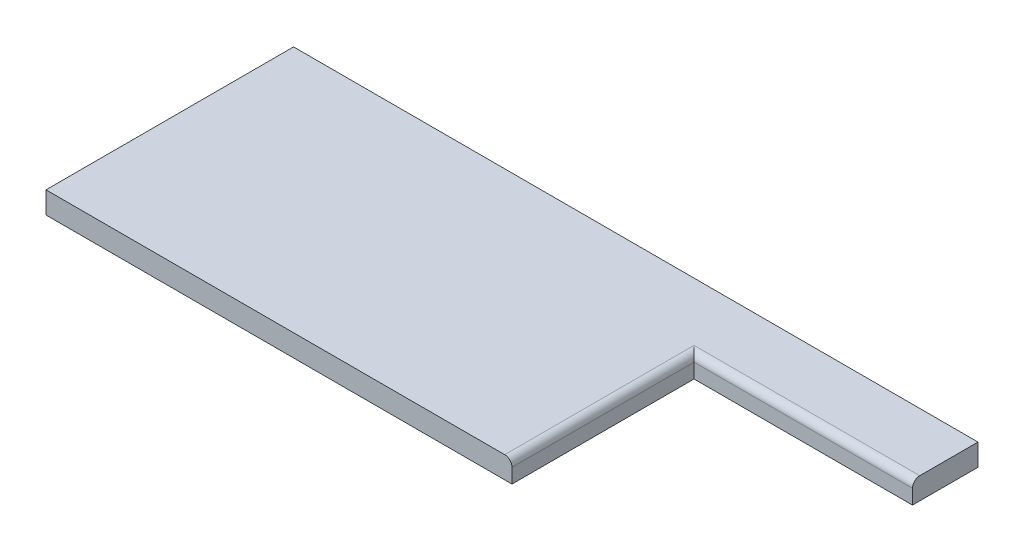
ISO-10303-21;
HEADER;
FILE_DESCRIPTION(('STEP AP214'),'2;1');
FILE_NAME('part.step','',(''),(''),'','','');
FILE_SCHEMA(('AUTOMOTIVE_DESIGN { 1 0 10303 214 1 1 1 1 }'));
ENDSEC;
DATA;
#1=APPLICATION_CONTEXT('core data for automotive mechanical design processes');
#2=APPLICATION_PROTOCOL_DEFINITION('international standard','automotive_design',2000,#1);
#3=PRODUCT_CONTEXT('',#1,'mechanical');
#4=PRODUCT('Part','Part','',(#3));
#5=PRODUCT_RELATED_PRODUCT_CATEGORY('part','',(#4));
#6=PRODUCT_DEFINITION_FORMATION('','',#4);
#7=PRODUCT_DEFINITION_CONTEXT('part definition',#1,'design');
#8=PRODUCT_DEFINITION('design','',#6,#7);
#9=PRODUCT_DEFINITION_SHAPE('','',#8);
#10=(LENGTH_UNIT() NAMED_UNIT(*) SI_UNIT(.MILLI.,.METRE.));
#11=(NAMED_UNIT(*) PLANE_ANGLE_UNIT() SI_UNIT($,.RADIAN.));
#12=(NAMED_UNIT(*) SI_UNIT($,.STERADIAN.) SOLID_ANGLE_UNIT());
#13=UNCERTAINTY_MEASURE_WITH_UNIT(LENGTH_MEASURE(1.E-05),#10,'distance_accuracy_value','');
#14=(GEOMETRIC_REPRESENTATION_CONTEXT(3) GLOBAL_UNCERTAINTY_ASSIGNED_CONTEXT((#13)) GLOBAL_UNIT_ASSIGNED_CONTEXT((#10,
#11,#12)) REPRESENTATION_CONTEXT('',''));
#15=CARTESIAN_POINT('',(0.,0.,0.));
#16=DIRECTION('',(0.,0.,1.));
#17=DIRECTION('',(1.,0.,0.));
#18=AXIS2_PLACEMENT_3D('',#15,#16,#17);
#19=CARTESIAN_POINT('',(0.,6.,0.));
#20=DIRECTION('',(1.,0.,0.));
#21=DIRECTION('',(0.,0.,-1.));
#22=AXIS2_PLACEMENT_3D('',#19,#20,#21);
#23=PLANE('',#22);
#24=DIRECTION('',(0.,0.,1.));
#25=VECTOR('',#24,1.);
#26=CARTESIAN_POINT('',(0.,0.,0.));
#27=LINE('',#26,#25);
#28=CARTESIAN_POINT('',(0.,0.,-68.));
#29=VERTEX_POINT('',#28);
#30=CARTESIAN_POINT('',(0.,0.,0.));
#31=VERTEX_POINT('',#30);
#32=EDGE_CURVE('E121',#29,#31,#27,.T.);
#33=ORIENTED_EDGE('',*,*,#32,.T.);
#34=DIRECTION('',(0.,-1.,0.));
#35=VECTOR('',#34,1.);
#36=CARTESIAN_POINT('',(0.,6.,0.));
#37=LINE('',#36,#35);
#38=CARTESIAN_POINT('',(0.,6.,0.));
#39=VERTEX_POINT('',#38);
#40=EDGE_CURVE('E131',#39,#31,#37,.T.);
#41=ORIENTED_EDGE('',*,*,#40,.F.);
#42=DIRECTION('',(0.,0.,1.));
#43=VECTOR('',#42,1.);
#44=CARTESIAN_POINT('',(0.,6.,0.));
#45=LINE('',#44,#43);
#46=CARTESIAN_POINT('',(0.,6.,-68.));
#47=VERTEX_POINT('',#46);
#48=EDGE_CURVE('E118',#47,#39,#45,.T.);
#49=ORIENTED_EDGE('',*,*,#48,.F.);
#50=DIRECTION('',(0.,-1.,0.));
#51=VECTOR('',#50,1.);
#52=CARTESIAN_POINT('',(0.,6.,-68.));
#53=LINE('',#52,#51);
#54=EDGE_CURVE('E125',#47,#29,#53,.T.);
#55=ORIENTED_EDGE('',*,*,#54,.T.);
#56=EDGE_LOOP('',(#33,#41,#49,#55));
#57=FACE_BOUND('',#56,.T.);
#58=ADVANCED_FACE('F32',(#57),#23,.F.);
#59=CARTESIAN_POINT('',(0.,6.,0.));
#60=DIRECTION('',(0.,0.,-1.));
#61=DIRECTION('',(-1.,0.,0.));
#62=AXIS2_PLACEMENT_3D('',#59,#60,#61);
#63=PLANE('',#62);
#64=DIRECTION('',(0.,1.,0.));
#65=VECTOR('',#64,1.);
#66=CARTESIAN_POINT('',(128.,0.,0.));
#67=LINE('',#66,#65);
#68=CARTESIAN_POINT('',(128.,0.,0.));
#69=VERTEX_POINT('',#68);
#70=CARTESIAN_POINT('',(128.,4.,0.));
#71=VERTEX_POINT('',#70);
#72=EDGE_CURVE('E148',#69,#71,#67,.T.);
#73=ORIENTED_EDGE('',*,*,#72,.T.);
#74=CARTESIAN_POINT('',(126.,4.,0.));
#75=DIRECTION('',(0.,0.,-1.));
#76=DIRECTION('',(-1.,0.,0.));
#77=AXIS2_PLACEMENT_3D('',#74,#75,#76);
#78=CIRCLE('',#77,2.);
#79=CARTESIAN_POINT('',(126.,6.,0.));
#80=VERTEX_POINT('',#79);
#81=EDGE_CURVE('E137',#71,#80,#78,.F.);
#82=ORIENTED_EDGE('',*,*,#81,.T.);
#83=DIRECTION('',(1.,0.,0.));
#84=VECTOR('',#83,1.);
#85=CARTESIAN_POINT('',(0.,6.,0.));
#86=LINE('',#85,#84);
#87=EDGE_CURVE('E155',#39,#80,#86,.T.);
#88=ORIENTED_EDGE('',*,*,#87,.F.);
#89=ORIENTED_EDGE('',*,*,#40,.T.);
#90=DIRECTION('',(1.,0.,0.));
#91=VECTOR('',#90,1.);
#92=CARTESIAN_POINT('',(0.,0.,0.));
#93=LINE('',#92,#91);
#94=EDGE_CURVE('E116',#31,#69,#93,.T.);
#95=ORIENTED_EDGE('',*,*,#94,.T.);
#96=EDGE_LOOP('',(#73,#82,#88,#89,#95));
#97=FACE_BOUND('',#96,.T.);
#98=ADVANCED_FACE('F154',(#97),#63,.F.);
#99=CARTESIAN_POINT('',(188.,6.,0.));
#100=DIRECTION('',(-1.,0.,0.));
#101=DIRECTION('',(0.,0.,1.));
#102=AXIS2_PLACEMENT_3D('',#99,#100,#101);
#103=PLANE('',#102);
#104=DIRECTION('',(0.,0.,-1.));
#105=VECTOR('',#104,1.);
#106=CARTESIAN_POINT('',(188.,6.,0.));
#107=LINE('',#106,#105);
#108=CARTESIAN_POINT('',(188.,6.,-52.));
#109=VERTEX_POINT('',#108);
#110=CARTESIAN_POINT('',(188.,6.,-68.));
#111=VERTEX_POINT('',#110);
#112=EDGE_CURVE('E160',#109,#111,#107,.T.);
#113=ORIENTED_EDGE('',*,*,#112,.F.);
#114=CARTESIAN_POINT('',(188.,4.,-52.));
#115=DIRECTION('',(-1.,0.,0.));
#116=DIRECTION('',(0.,0.,1.));
#117=AXIS2_PLACEMENT_3D('',#114,#115,#116);
#118=CIRCLE('',#117,2.);
#119=CARTESIAN_POINT('',(188.,4.,-50.));
#120=VERTEX_POINT('',#119);
#121=EDGE_CURVE('E11',#109,#120,#118,.F.);
#122=ORIENTED_EDGE('',*,*,#121,.T.);
#123=DIRECTION('',(0.,1.,0.));
#124=VECTOR('',#123,1.);
#125=CARTESIAN_POINT('',(188.,0.,-50.));
#126=LINE('',#125,#124);
#127=CARTESIAN_POINT('',(188.,0.,-50.));
#128=VERTEX_POINT('',#127);
#129=EDGE_CURVE('E98',#128,#120,#126,.T.);
#130=ORIENTED_EDGE('',*,*,#129,.F.);
#131=DIRECTION('',(0.,0.,-1.));
#132=VECTOR('',#131,1.);
#133=CARTESIAN_POINT('',(188.,0.,0.));
#134=LINE('',#133,#132);
#135=CARTESIAN_POINT('',(188.,0.,-68.));
#136=VERTEX_POINT('',#135);
#137=EDGE_CURVE('E109',#128,#136,#134,.T.);
#138=ORIENTED_EDGE('',*,*,#137,.T.);
#139=DIRECTION('',(0.,-1.,0.));
#140=VECTOR('',#139,1.);
#141=CARTESIAN_POINT('',(188.,6.,-68.));
#142=LINE('',#141,#140);
#143=EDGE_CURVE('E128',#111,#136,#142,.T.);
#144=ORIENTED_EDGE('',*,*,#143,.F.);
#145=EDGE_LOOP('',(#113,#122,#130,#138,#144));
#146=FACE_BOUND('',#145,.T.);
#147=ADVANCED_FACE('F107',(#146),#103,.F.);
#148=CARTESIAN_POINT('',(0.,6.,-68.));
#149=DIRECTION('',(0.,0.,1.));
#150=DIRECTION('',(1.,0.,0.));
#151=AXIS2_PLACEMENT_3D('',#148,#149,#150);
#152=PLANE('',#151);
#153=DIRECTION('',(-1.,0.,0.));
#154=VECTOR('',#153,1.);
#155=CARTESIAN_POINT('',(0.,0.,-68.));
#156=LINE('',#155,#154);
#157=EDGE_CURVE('E115',#136,#29,#156,.T.);
#158=ORIENTED_EDGE('',*,*,#157,.T.);
#159=ORIENTED_EDGE('',*,*,#54,.F.);
#160=DIRECTION('',(-1.,0.,0.));
#161=VECTOR('',#160,1.);
#162=CARTESIAN_POINT('',(0.,6.,-68.));
#163=LINE('',#162,#161);
#164=EDGE_CURVE('E129',#111,#47,#163,.T.);
#165=ORIENTED_EDGE('',*,*,#164,.F.);
#166=ORIENTED_EDGE('',*,*,#143,.T.);
#167=EDGE_LOOP('',(#158,#159,#165,#166));
#168=FACE_BOUND('',#167,.T.);
#169=ADVANCED_FACE('F172',(#168),#152,.F.);
#170=CARTESIAN_POINT('',(0.,6.,0.));
#171=DIRECTION('',(0.,-1.,0.));
#172=DIRECTION('',(0.,0.,-1.));
#173=AXIS2_PLACEMENT_3D('',#170,#171,#172);
#174=PLANE('',#173);
#175=ORIENTED_EDGE('',*,*,#87,.T.);
#176=DIRECTION('',(0.,0.,1.));
#177=VECTOR('',#176,1.);
#178=CARTESIAN_POINT('',(126.,6.,0.));
#179=LINE('',#178,#177);
#180=CARTESIAN_POINT('',(126.,6.,-52.));
#181=VERTEX_POINT('',#180);
#182=EDGE_CURVE('E54',#80,#181,#179,.F.);
#183=ORIENTED_EDGE('',*,*,#182,.T.);
#184=DIRECTION('',(-1.,0.,0.));
#185=VECTOR('',#184,1.);
#186=CARTESIAN_POINT('',(0.,6.,-52.));
#187=LINE('',#186,#185);
#188=EDGE_CURVE('E139',#181,#109,#187,.F.);
#189=ORIENTED_EDGE('',*,*,#188,.T.);
#190=ORIENTED_EDGE('',*,*,#112,.T.);
#191=ORIENTED_EDGE('',*,*,#164,.T.);
#192=ORIENTED_EDGE('',*,*,#48,.T.);
#193=EDGE_LOOP('',(#175,#183,#189,#190,#191,#192));
#194=FACE_BOUND('',#193,.T.);
#195=ADVANCED_FACE('F157',(#194),#174,.F.);
#196=CARTESIAN_POINT('',(0.,0.,0.));
#197=DIRECTION('',(0.,-1.,0.));
#198=DIRECTION('',(0.,0.,-1.));
#199=AXIS2_PLACEMENT_3D('',#196,#197,#198);
#200=PLANE('',#199);
#201=DIRECTION('',(0.,0.,1.));
#202=VECTOR('',#201,1.);
#203=CARTESIAN_POINT('',(128.,0.,-50.));
#204=LINE('',#203,#202);
#205=CARTESIAN_POINT('',(128.,0.,-50.));
#206=VERTEX_POINT('',#205);
#207=EDGE_CURVE('E105',#206,#69,#204,.T.);
#208=ORIENTED_EDGE('',*,*,#207,.T.);
#209=ORIENTED_EDGE('',*,*,#94,.F.);
#210=ORIENTED_EDGE('',*,*,#32,.F.);
#211=ORIENTED_EDGE('',*,*,#157,.F.);
#212=ORIENTED_EDGE('',*,*,#137,.F.);
#213=DIRECTION('',(-1.,0.,0.));
#214=VECTOR('',#213,1.);
#215=CARTESIAN_POINT('',(188.,0.,-50.));
#216=LINE('',#215,#214);
#217=EDGE_CURVE('E96',#128,#206,#216,.T.);
#218=ORIENTED_EDGE('',*,*,#217,.T.);
#219=EDGE_LOOP('',(#208,#209,#210,#211,#212,#218));
#220=FACE_BOUND('',#219,.T.);
#221=ADVANCED_FACE('F113',(#220),#200,.T.);
#222=CARTESIAN_POINT('',(128.,0.,-50.));
#223=DIRECTION('',(-1.,0.,0.));
#224=DIRECTION('',(0.,0.,1.));
#225=AXIS2_PLACEMENT_3D('',#222,#223,#224);
#226=PLANE('',#225);
#227=DIRECTION('',(0.,1.,0.));
#228=VECTOR('',#227,1.);
#229=CARTESIAN_POINT('',(128.,0.,-50.));
#230=LINE('',#229,#228);
#231=CARTESIAN_POINT('',(128.,4.,-50.));
#232=VERTEX_POINT('',#231);
#233=EDGE_CURVE('E101',#206,#232,#230,.T.);
#234=ORIENTED_EDGE('',*,*,#233,.T.);
#235=DIRECTION('',(0.,0.,1.));
#236=VECTOR('',#235,1.);
#237=CARTESIAN_POINT('',(128.,4.,-50.));
#238=LINE('',#237,#236);
#239=EDGE_CURVE('E134',#232,#71,#238,.T.);
#240=ORIENTED_EDGE('',*,*,#239,.T.);
#241=ORIENTED_EDGE('',*,*,#72,.F.);
#242=ORIENTED_EDGE('',*,*,#207,.F.);
#243=EDGE_LOOP('',(#234,#240,#241,#242));
#244=FACE_BOUND('',#243,.T.);
#245=ADVANCED_FACE('F145',(#244),#226,.F.);
#246=CARTESIAN_POINT('',(188.,0.,-50.));
#247=DIRECTION('',(0.,0.,-1.));
#248=DIRECTION('',(-1.,0.,0.));
#249=AXIS2_PLACEMENT_3D('',#246,#247,#248);
#250=PLANE('',#249);
#251=ORIENTED_EDGE('',*,*,#129,.T.);
#252=DIRECTION('',(-1.,0.,0.));
#253=VECTOR('',#252,1.);
#254=CARTESIAN_POINT('',(188.,4.,-50.));
#255=LINE('',#254,#253);
#256=EDGE_CURVE('E41',#120,#232,#255,.T.);
#257=ORIENTED_EDGE('',*,*,#256,.T.);
#258=ORIENTED_EDGE('',*,*,#233,.F.);
#259=ORIENTED_EDGE('',*,*,#217,.F.);
#260=EDGE_LOOP('',(#251,#257,#258,#259));
#261=FACE_BOUND('',#260,.T.);
#262=ADVANCED_FACE('F97',(#261),#250,.F.);
#263=CARTESIAN_POINT('',(188.,4.,-52.));
#264=DIRECTION('',(-1.,0.,0.));
#265=DIRECTION('',(0.,0.,1.));
#266=AXIS2_PLACEMENT_3D('',#263,#264,#265);
#267=CYLINDRICAL_SURFACE('',#266,2.);
#268=ORIENTED_EDGE('',*,*,#121,.F.);
#269=ORIENTED_EDGE('',*,*,#188,.F.);
#270=CARTESIAN_POINT('',(126.,4.,-52.));
#271=DIRECTION('',(-0.707106781186547,0.,0.707106781186548));
#272=DIRECTION('',(0.707106781186548,0.,0.707106781186547));
#273=AXIS2_PLACEMENT_3D('',#270,#271,#272);
#274=ELLIPSE('',#273,2.82842712474619,2.);
#275=EDGE_CURVE('E36',#232,#181,#274,.T.);
#276=ORIENTED_EDGE('',*,*,#275,.F.);
#277=ORIENTED_EDGE('',*,*,#256,.F.);
#278=EDGE_LOOP('',(#268,#269,#276,#277));
#279=FACE_BOUND('',#278,.T.);
#280=ADVANCED_FACE('F34',(#279),#267,.T.);
#281=CARTESIAN_POINT('',(126.,4.,-50.));
#282=DIRECTION('',(0.,0.,1.));
#283=DIRECTION('',(1.,0.,0.));
#284=AXIS2_PLACEMENT_3D('',#281,#282,#283);
#285=CYLINDRICAL_SURFACE('',#284,2.);
#286=ORIENTED_EDGE('',*,*,#275,.T.);
#287=ORIENTED_EDGE('',*,*,#182,.F.);
#288=ORIENTED_EDGE('',*,*,#81,.F.);
#289=ORIENTED_EDGE('',*,*,#239,.F.);
#290=EDGE_LOOP('',(#286,#287,#288,#289));
#291=FACE_BOUND('',#290,.T.);
#292=ADVANCED_FACE('F152',(#291),#285,.T.);
#293=CLOSED_SHELL('',(#58,#98,#147,#169,#195,#221,#245,#262,#280,#292));
#294=MANIFOLD_SOLID_BREP('B2',#293);
#295=ADVANCED_BREP_SHAPE_REPRESENTATION('',(#18,#294),#14);
#296=SHAPE_DEFINITION_REPRESENTATION(#9,#295);
ENDSEC;
END-ISO-10303-21;
